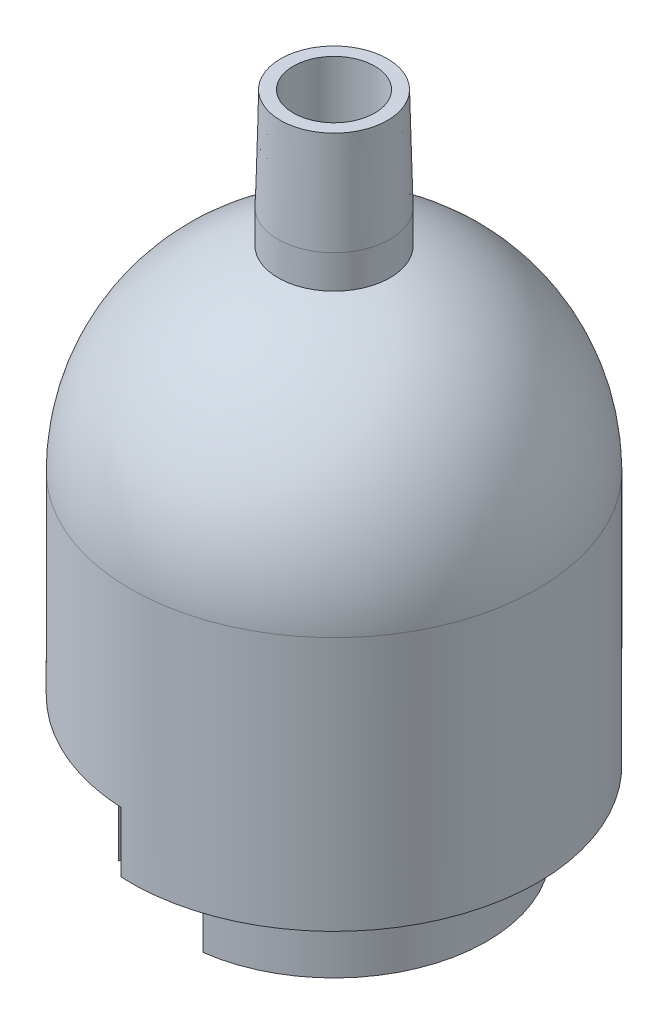
ISO-10303-21;
HEADER;
FILE_DESCRIPTION(('STEP AP214'),'2;1');
FILE_NAME('part.step','',(''),(''),'','','');
FILE_SCHEMA(('AUTOMOTIVE_DESIGN { 1 0 10303 214 1 1 1 1 }'));
ENDSEC;
DATA;
#1=APPLICATION_CONTEXT('core data for automotive mechanical design processes');
#2=APPLICATION_PROTOCOL_DEFINITION('international standard','automotive_design',2000,#1);
#3=PRODUCT_CONTEXT('',#1,'mechanical');
#4=PRODUCT('Part','Part','',(#3));
#5=PRODUCT_RELATED_PRODUCT_CATEGORY('part','',(#4));
#6=PRODUCT_DEFINITION_FORMATION('','',#4);
#7=PRODUCT_DEFINITION_CONTEXT('part definition',#1,'design');
#8=PRODUCT_DEFINITION('design','',#6,#7);
#9=PRODUCT_DEFINITION_SHAPE('','',#8);
#10=(LENGTH_UNIT() NAMED_UNIT(*) SI_UNIT(.MILLI.,.METRE.));
#11=(NAMED_UNIT(*) PLANE_ANGLE_UNIT() SI_UNIT($,.RADIAN.));
#12=(NAMED_UNIT(*) SI_UNIT($,.STERADIAN.) SOLID_ANGLE_UNIT());
#13=UNCERTAINTY_MEASURE_WITH_UNIT(LENGTH_MEASURE(1.E-05),#10,'distance_accuracy_value','');
#14=(GEOMETRIC_REPRESENTATION_CONTEXT(3) GLOBAL_UNCERTAINTY_ASSIGNED_CONTEXT((#13)) GLOBAL_UNIT_ASSIGNED_CONTEXT((#10,
#11,#12)) REPRESENTATION_CONTEXT('',''));
#15=CARTESIAN_POINT('',(0.,0.,0.));
#16=DIRECTION('',(0.,0.,1.));
#17=DIRECTION('',(1.,0.,0.));
#18=AXIS2_PLACEMENT_3D('',#15,#16,#17);
#19=CARTESIAN_POINT('',(0.,0.,0.));
#20=DIRECTION('',(0.,1.,0.));
#21=DIRECTION('',(0.,0.,1.));
#22=AXIS2_PLACEMENT_3D('',#19,#20,#21);
#23=PLANE('',#22);
#24=CARTESIAN_POINT('',(-21.1602690825293,0.,-29.1246117974979));
#25=DIRECTION('',(0.,-1.,0.));
#26=DIRECTION('',(0.,0.,-1.));
#27=AXIS2_PLACEMENT_3D('',#24,#25,#26);
#28=CIRCLE('',#27,1.5);
#29=CARTESIAN_POINT('',(-21.1602690825293,0.,-30.6246117974979));
#30=VERTEX_POINT('',#29);
#31=EDGE_CURVE('E285',#30,#30,#28,.T.);
#32=ORIENTED_EDGE('',*,*,#31,.F.);
#33=EDGE_LOOP('',(#32));
#34=FACE_BOUND('',#33,.T.);
#35=CARTESIAN_POINT('',(-34.2380345866256,0.,-11.1246117974978));
#36=DIRECTION('',(0.,-1.,0.));
#37=DIRECTION('',(0.,0.,-1.));
#38=AXIS2_PLACEMENT_3D('',#35,#36,#37);
#39=CIRCLE('',#38,1.5);
#40=CARTESIAN_POINT('',(-34.2380345866256,0.,-12.6246117974978));
#41=VERTEX_POINT('',#40);
#42=EDGE_CURVE('E268',#41,#41,#39,.T.);
#43=ORIENTED_EDGE('',*,*,#42,.F.);
#44=EDGE_LOOP('',(#43));
#45=FACE_BOUND('',#44,.T.);
#46=CARTESIAN_POINT('',(-34.2380345866254,0.,11.1246117974985));
#47=DIRECTION('',(0.,-1.,0.));
#48=DIRECTION('',(0.,0.,-1.));
#49=AXIS2_PLACEMENT_3D('',#46,#47,#48);
#50=CIRCLE('',#49,1.5);
#51=CARTESIAN_POINT('',(-34.2380345866254,0.,9.62461179749849));
#52=VERTEX_POINT('',#51);
#53=EDGE_CURVE('E239',#52,#52,#50,.T.);
#54=ORIENTED_EDGE('',*,*,#53,.F.);
#55=EDGE_LOOP('',(#54));
#56=FACE_BOUND('',#55,.T.);
#57=DIRECTION('',(-0.819178042205052,0.,0.573539305688021));
#58=VECTOR('',#57,1.);
#59=CARTESIAN_POINT('',(-3.81627640035369,0.,-5.45073336587605));
#60=LINE('',#59,#58);
#61=CARTESIAN_POINT('',(-30.2939246678071,0.,13.0873270082637));
#62=VERTEX_POINT('',#61);
#63=CARTESIAN_POINT('',(-36.126859333869,0.,17.1711978228324));
#64=VERTEX_POINT('',#63);
#65=EDGE_CURVE('E204',#62,#64,#60,.T.);
#66=ORIENTED_EDGE('',*,*,#65,.T.);
#67=CARTESIAN_POINT('',(0.,0.,0.));
#68=DIRECTION('',(0.,1.,0.));
#69=DIRECTION('',(0.,0.,1.));
#70=AXIS2_PLACEMENT_3D('',#67,#68,#69);
#71=CIRCLE('',#70,40.);
#72=CARTESIAN_POINT('',(-19.5058879135128,0.,-34.9216313580204));
#73=VERTEX_POINT('',#72);
#74=EDGE_CURVE('E68',#73,#64,#71,.T.);
#75=ORIENTED_EDGE('',*,*,#74,.F.);
#76=DIRECTION('',(-0.487647197837817,0.,-0.873040783950512));
#77=VECTOR('',#76,1.);
#78=CARTESIAN_POINT('',(-1.40847043936586E-13,0.,0.));
#79=LINE('',#78,#77);
#80=CARTESIAN_POINT('',(-16.0923575286481,0.,-28.8103458703668));
#81=VERTEX_POINT('',#80);
#82=EDGE_CURVE('E231',#81,#73,#79,.T.);
#83=ORIENTED_EDGE('',*,*,#82,.F.);
#84=CARTESIAN_POINT('',(0.,0.,0.));
#85=DIRECTION('',(0.,-1.,0.));
#86=DIRECTION('',(0.,0.,-1.));
#87=AXIS2_PLACEMENT_3D('',#84,#85,#86);
#88=CIRCLE('',#87,33.);
#89=EDGE_CURVE('E228',#62,#81,#88,.T.);
#90=ORIENTED_EDGE('',*,*,#89,.F.);
#91=EDGE_LOOP('',(#66,#75,#83,#90));
#92=FACE_BOUND('',#91,.T.);
#93=ADVANCED_FACE('F57',(#34,#45,#56,#92),#23,.F.);
#94=CARTESIAN_POINT('',(0.,50.,0.));
#95=DIRECTION('',(0.,-1.,0.));
#96=DIRECTION('',(0.,0.,-1.));
#97=AXIS2_PLACEMENT_3D('',#94,#95,#96);
#98=CYLINDRICAL_SURFACE('',#97,40.);
#99=CARTESIAN_POINT('',(0.,50.,0.));
#100=DIRECTION('',(0.,1.,0.));
#101=DIRECTION('',(0.,0.,1.));
#102=AXIS2_PLACEMENT_3D('',#99,#100,#101);
#103=CIRCLE('',#102,40.);
#104=CARTESIAN_POINT('',(0.,50.,40.));
#105=VERTEX_POINT('',#104);
#106=EDGE_CURVE('E12',#105,#105,#103,.T.);
#107=ORIENTED_EDGE('',*,*,#106,.F.);
#108=EDGE_LOOP('',(#107));
#109=FACE_BOUND('',#108,.T.);
#110=DIRECTION('',(0.,-1.,0.));
#111=VECTOR('',#110,1.);
#112=CARTESIAN_POINT('',(-36.126859333869,11.84997677,17.1711978228324));
#113=LINE('',#112,#111);
#114=CARTESIAN_POINT('',(-36.126859333869,11.84997677,17.1711978228324));
#115=VERTEX_POINT('',#114);
#116=EDGE_CURVE('E237',#115,#64,#113,.T.);
#117=ORIENTED_EDGE('',*,*,#116,.F.);
#118=CARTESIAN_POINT('',(0.,11.84997677,0.));
#119=DIRECTION('',(0.,-1.,0.));
#120=DIRECTION('',(0.,0.,-1.));
#121=AXIS2_PLACEMENT_3D('',#118,#119,#120);
#122=CIRCLE('',#121,40.);
#123=CARTESIAN_POINT('',(-1.9505371321681,11.84997677,39.9524142561627));
#124=VERTEX_POINT('',#123);
#125=EDGE_CURVE('E218',#124,#115,#122,.T.);
#126=ORIENTED_EDGE('',*,*,#125,.F.);
#127=DIRECTION('',(0.,-1.,0.));
#128=VECTOR('',#127,1.);
#129=CARTESIAN_POINT('',(-1.9505371321681,11.84997677,39.9524142561627));
#130=LINE('',#129,#128);
#131=CARTESIAN_POINT('',(-1.9505371321681,0.,39.9524142561627));
#132=VERTEX_POINT('',#131);
#133=EDGE_CURVE('E240',#124,#132,#130,.T.);
#134=ORIENTED_EDGE('',*,*,#133,.T.);
#135=CARTESIAN_POINT('',(4.19737007297038,0.,-39.7791664627419));
#136=VERTEX_POINT('',#135);
#137=EDGE_CURVE('E294',#132,#136,#71,.T.);
#138=ORIENTED_EDGE('',*,*,#137,.T.);
#139=DIRECTION('',(0.,-1.,0.));
#140=VECTOR('',#139,1.);
#141=CARTESIAN_POINT('',(4.19737007297038,11.84997677,-39.7791664627419));
#142=LINE('',#141,#140);
#143=CARTESIAN_POINT('',(4.19737007297038,11.84997677,-39.7791664627419));
#144=VERTEX_POINT('',#143);
#145=EDGE_CURVE('E248',#144,#136,#142,.T.);
#146=ORIENTED_EDGE('',*,*,#145,.F.);
#147=CARTESIAN_POINT('',(-19.5058879135128,11.84997677,-34.9216313580204));
#148=VERTEX_POINT('',#147);
#149=EDGE_CURVE('E214',#148,#144,#122,.T.);
#150=ORIENTED_EDGE('',*,*,#149,.F.);
#151=DIRECTION('',(0.,-1.,0.));
#152=VECTOR('',#151,1.);
#153=CARTESIAN_POINT('',(-19.5058879135128,11.84997677,-34.9216313580204));
#154=LINE('',#153,#152);
#155=EDGE_CURVE('E250',#148,#73,#154,.T.);
#156=ORIENTED_EDGE('',*,*,#155,.T.);
#157=ORIENTED_EDGE('',*,*,#74,.T.);
#158=EDGE_LOOP('',(#117,#126,#134,#138,#146,#150,#156,#157));
#159=FACE_BOUND('',#158,.T.);
#160=ADVANCED_FACE('F59',(#109,#159),#98,.T.);
#161=CARTESIAN_POINT('',(21.1602690825291,0.,29.1246117974981));
#162=DIRECTION('',(0.,-1.,0.));
#163=DIRECTION('',(0.,0.,-1.));
#164=AXIS2_PLACEMENT_3D('',#161,#162,#163);
#165=CIRCLE('',#164,1.5);
#166=CARTESIAN_POINT('',(21.1602690825291,0.,27.6246117974981));
#167=VERTEX_POINT('',#166);
#168=EDGE_CURVE('E261',#167,#167,#165,.T.);
#169=ORIENTED_EDGE('',*,*,#168,.F.);
#170=EDGE_LOOP('',(#169));
#171=FACE_BOUND('',#170,.T.);
#172=CARTESIAN_POINT('',(34.2380345866255,0.,-11.1246117974983));
#173=DIRECTION('',(0.,-1.,0.));
#174=DIRECTION('',(0.,0.,-1.));
#175=AXIS2_PLACEMENT_3D('',#172,#173,#174);
#176=CIRCLE('',#175,1.5);
#177=CARTESIAN_POINT('',(34.2380345866255,0.,-12.6246117974983));
#178=VERTEX_POINT('',#177);
#179=EDGE_CURVE('E279',#178,#178,#176,.T.);
#180=ORIENTED_EDGE('',*,*,#179,.F.);
#181=EDGE_LOOP('',(#180));
#182=FACE_BOUND('',#181,.T.);
#183=CARTESIAN_POINT('',(34.2380345866256,0.,11.124611797498));
#184=DIRECTION('',(0.,-1.,0.));
#185=DIRECTION('',(0.,0.,-1.));
#186=AXIS2_PLACEMENT_3D('',#183,#184,#185);
#187=CIRCLE('',#186,1.5);
#188=CARTESIAN_POINT('',(34.2380345866256,0.,9.62461179749802));
#189=VERTEX_POINT('',#188);
#190=EDGE_CURVE('E273',#189,#189,#187,.T.);
#191=ORIENTED_EDGE('',*,*,#190,.F.);
#192=EDGE_LOOP('',(#191));
#193=FACE_BOUND('',#192,.T.);
#194=ORIENTED_EDGE('',*,*,#137,.F.);
#195=DIRECTION('',(-0.0487634283041756,0.,0.998810356404069));
#196=VECTOR('',#195,1.);
#197=CARTESIAN_POINT('',(-1.07793096146607E-12,0.,0.));
#198=LINE('',#197,#196);
#199=CARTESIAN_POINT('',(-1.46290284912635,0.,29.964310692122));
#200=VERTEX_POINT('',#199);
#201=EDGE_CURVE('E208',#200,#132,#198,.T.);
#202=ORIENTED_EDGE('',*,*,#201,.F.);
#203=CARTESIAN_POINT('',(0.,0.,0.));
#204=DIRECTION('',(0.,1.,0.));
#205=DIRECTION('',(0.,0.,1.));
#206=AXIS2_PLACEMENT_3D('',#203,#204,#205);
#207=CIRCLE('',#206,30.);
#208=CARTESIAN_POINT('',(4.00883862894171,0.,29.7309470560072));
#209=VERTEX_POINT('',#208);
#210=EDGE_CURVE('E260',#200,#209,#207,.T.);
#211=ORIENTED_EDGE('',*,*,#210,.T.);
#212=CARTESIAN_POINT('',(0.,0.,0.));
#213=DIRECTION('',(0.,1.,0.));
#214=DIRECTION('',(0.,0.,1.));
#215=AXIS2_PLACEMENT_3D('',#212,#213,#214);
#216=CIRCLE('',#215,30.);
#217=CARTESIAN_POINT('',(3.14802755472722,0.,-29.8343748470565));
#218=VERTEX_POINT('',#217);
#219=EDGE_CURVE('E198',#209,#218,#216,.T.);
#220=ORIENTED_EDGE('',*,*,#219,.T.);
#221=DIRECTION('',(0.104934251824316,0.,-0.994479161568542));
#222=VECTOR('',#221,1.);
#223=CARTESIAN_POINT('',(-2.26511715484874E-12,0.,-2.39007897926772E-13));
#224=LINE('',#223,#222);
#225=EDGE_CURVE('E233',#218,#136,#224,.T.);
#226=ORIENTED_EDGE('',*,*,#225,.T.);
#227=EDGE_LOOP('',(#194,#202,#211,#220,#226));
#228=FACE_BOUND('',#227,.T.);
#229=ADVANCED_FACE('F360',(#171,#182,#193,#228),#23,.F.);
#230=CARTESIAN_POINT('',(0.,50.,0.));
#231=DIRECTION('',(0.,-1.,0.));
#232=DIRECTION('',(0.,0.,-1.));
#233=AXIS2_PLACEMENT_3D('',#230,#231,#232);
#234=CYLINDRICAL_SURFACE('',#233,30.);
#235=DIRECTION('',(0.,-1.,0.));
#236=VECTOR('',#235,1.);
#237=CARTESIAN_POINT('',(4.0088386289417,21.84997677,29.7309470560072));
#238=LINE('',#237,#236);
#239=CARTESIAN_POINT('',(4.00883862894171,21.84997677,29.7309470560072));
#240=VERTEX_POINT('',#239);
#241=EDGE_CURVE('E199',#240,#209,#238,.T.);
#242=ORIENTED_EDGE('',*,*,#241,.T.);
#243=ORIENTED_EDGE('',*,*,#210,.F.);
#244=DIRECTION('',(0.,-1.,0.));
#245=VECTOR('',#244,1.);
#246=CARTESIAN_POINT('',(-1.46290284912635,11.84997677,29.964310692122));
#247=LINE('',#246,#245);
#248=CARTESIAN_POINT('',(-1.46290284912635,11.84997677,29.964310692122));
#249=VERTEX_POINT('',#248);
#250=EDGE_CURVE('E243',#249,#200,#247,.T.);
#251=ORIENTED_EDGE('',*,*,#250,.F.);
#252=CARTESIAN_POINT('',(0.,11.84997677,0.));
#253=DIRECTION('',(0.,-1.,0.));
#254=DIRECTION('',(0.,0.,-1.));
#255=AXIS2_PLACEMENT_3D('',#252,#253,#254);
#256=CIRCLE('',#255,30.);
#257=CARTESIAN_POINT('',(-19.9092408020485,11.84997677,22.441526924121));
#258=VERTEX_POINT('',#257);
#259=EDGE_CURVE('E221',#249,#258,#256,.T.);
#260=ORIENTED_EDGE('',*,*,#259,.T.);
#261=DIRECTION('',(0.,-1.,0.));
#262=VECTOR('',#261,1.);
#263=CARTESIAN_POINT('',(-19.9092408020485,21.84997677,22.441526924121));
#264=LINE('',#263,#262);
#265=CARTESIAN_POINT('',(-19.9092408020485,21.84997677,22.441526924121));
#266=VERTEX_POINT('',#265);
#267=EDGE_CURVE('E81',#266,#258,#264,.T.);
#268=ORIENTED_EDGE('',*,*,#267,.F.);
#269=CARTESIAN_POINT('',(0.,21.84997677,0.));
#270=DIRECTION('',(0.,-1.,0.));
#271=DIRECTION('',(0.,0.,-1.));
#272=AXIS2_PLACEMENT_3D('',#269,#270,#271);
#273=CIRCLE('',#272,30.);
#274=EDGE_CURVE('E76',#266,#240,#273,.T.);
#275=ORIENTED_EDGE('',*,*,#274,.T.);
#276=EDGE_LOOP('',(#242,#243,#251,#260,#268,#275));
#277=FACE_BOUND('',#276,.T.);
#278=CARTESIAN_POINT('',(0.,50.,0.));
#279=DIRECTION('',(0.,1.,0.));
#280=DIRECTION('',(0.,0.,-1.));
#281=AXIS2_PLACEMENT_3D('',#278,#279,#280);
#282=CIRCLE('',#281,30.);
#283=CARTESIAN_POINT('',(0.,50.0000000000002,-30.));
#284=VERTEX_POINT('',#283);
#285=EDGE_CURVE('E181',#284,#284,#282,.T.);
#286=ORIENTED_EDGE('',*,*,#285,.T.);
#287=EDGE_LOOP('',(#286));
#288=FACE_BOUND('',#287,.T.);
#289=ADVANCED_FACE('F369',(#277,#288),#234,.F.);
#290=CARTESIAN_POINT('',(34.2380345866256,6.,11.124611797498));
#291=DIRECTION('',(0.,-1.,0.));
#292=DIRECTION('',(0.,0.,-1.));
#293=AXIS2_PLACEMENT_3D('',#290,#291,#292);
#294=CYLINDRICAL_SURFACE('',#293,1.5);
#295=CARTESIAN_POINT('',(34.2380345866256,6.,11.124611797498));
#296=DIRECTION('',(0.,-1.,0.));
#297=DIRECTION('',(0.,0.,-1.));
#298=AXIS2_PLACEMENT_3D('',#295,#296,#297);
#299=CIRCLE('',#298,1.5);
#300=CARTESIAN_POINT('',(34.2380345866256,6.,9.62461179749802));
#301=VERTEX_POINT('',#300);
#302=EDGE_CURVE('E264',#301,#301,#299,.T.);
#303=ORIENTED_EDGE('',*,*,#302,.F.);
#304=EDGE_LOOP('',(#303));
#305=FACE_BOUND('',#304,.T.);
#306=ORIENTED_EDGE('',*,*,#190,.T.);
#307=EDGE_LOOP('',(#306));
#308=FACE_BOUND('',#307,.T.);
#309=ADVANCED_FACE('F374',(#305,#308),#294,.F.);
#310=CARTESIAN_POINT('',(34.2380345866256,6.,11.124611797498));
#311=DIRECTION('',(0.,-1.,0.));
#312=DIRECTION('',(0.,0.,-1.));
#313=AXIS2_PLACEMENT_3D('',#310,#311,#312);
#314=PLANE('',#313);
#315=ORIENTED_EDGE('',*,*,#302,.T.);
#316=EDGE_LOOP('',(#315));
#317=FACE_BOUND('',#316,.T.);
#318=ADVANCED_FACE('F455',(#317),#314,.T.);
#319=CARTESIAN_POINT('',(34.2380345866255,6.,-11.1246117974983));
#320=DIRECTION('',(0.,-1.,0.));
#321=DIRECTION('',(0.,0.,-1.));
#322=AXIS2_PLACEMENT_3D('',#319,#320,#321);
#323=CYLINDRICAL_SURFACE('',#322,1.5);
#324=CARTESIAN_POINT('',(34.2380345866255,6.,-11.1246117974983));
#325=DIRECTION('',(0.,-1.,0.));
#326=DIRECTION('',(0.,0.,-1.));
#327=AXIS2_PLACEMENT_3D('',#324,#325,#326);
#328=CIRCLE('',#327,1.5);
#329=CARTESIAN_POINT('',(34.2380345866255,6.,-12.6246117974983));
#330=VERTEX_POINT('',#329);
#331=EDGE_CURVE('E276',#330,#330,#328,.T.);
#332=ORIENTED_EDGE('',*,*,#331,.F.);
#333=EDGE_LOOP('',(#332));
#334=FACE_BOUND('',#333,.T.);
#335=ORIENTED_EDGE('',*,*,#179,.T.);
#336=EDGE_LOOP('',(#335));
#337=FACE_BOUND('',#336,.T.);
#338=ADVANCED_FACE('F458',(#334,#337),#323,.F.);
#339=CARTESIAN_POINT('',(34.2380345866255,6.,-11.1246117974983));
#340=DIRECTION('',(0.,-1.,0.));
#341=DIRECTION('',(0.,0.,-1.));
#342=AXIS2_PLACEMENT_3D('',#339,#340,#341);
#343=PLANE('',#342);
#344=ORIENTED_EDGE('',*,*,#331,.T.);
#345=EDGE_LOOP('',(#344));
#346=FACE_BOUND('',#345,.T.);
#347=ADVANCED_FACE('F463',(#346),#343,.T.);
#348=CARTESIAN_POINT('',(-21.1602690825293,6.,-29.1246117974979));
#349=DIRECTION('',(0.,-1.,0.));
#350=DIRECTION('',(0.,0.,-1.));
#351=AXIS2_PLACEMENT_3D('',#348,#349,#350);
#352=CYLINDRICAL_SURFACE('',#351,1.5);
#353=CARTESIAN_POINT('',(-21.1602690825293,6.,-29.1246117974979));
#354=DIRECTION('',(0.,-1.,0.));
#355=DIRECTION('',(0.,0.,-1.));
#356=AXIS2_PLACEMENT_3D('',#353,#354,#355);
#357=CIRCLE('',#356,1.5);
#358=CARTESIAN_POINT('',(-21.1602690825293,6.,-30.6246117974979));
#359=VERTEX_POINT('',#358);
#360=EDGE_CURVE('E282',#359,#359,#357,.T.);
#361=ORIENTED_EDGE('',*,*,#360,.F.);
#362=EDGE_LOOP('',(#361));
#363=FACE_BOUND('',#362,.T.);
#364=ORIENTED_EDGE('',*,*,#31,.T.);
#365=EDGE_LOOP('',(#364));
#366=FACE_BOUND('',#365,.T.);
#367=ADVANCED_FACE('F466',(#363,#366),#352,.F.);
#368=CARTESIAN_POINT('',(-21.1602690825293,6.,-29.1246117974979));
#369=DIRECTION('',(0.,-1.,0.));
#370=DIRECTION('',(0.,0.,-1.));
#371=AXIS2_PLACEMENT_3D('',#368,#369,#370);
#372=PLANE('',#371);
#373=ORIENTED_EDGE('',*,*,#360,.T.);
#374=EDGE_LOOP('',(#373));
#375=FACE_BOUND('',#374,.T.);
#376=ADVANCED_FACE('F471',(#375),#372,.T.);
#377=CARTESIAN_POINT('',(-34.2380345866256,6.,-11.1246117974978));
#378=DIRECTION('',(0.,-1.,0.));
#379=DIRECTION('',(0.,0.,-1.));
#380=AXIS2_PLACEMENT_3D('',#377,#378,#379);
#381=CYLINDRICAL_SURFACE('',#380,1.5);
#382=CARTESIAN_POINT('',(-34.2380345866256,6.,-11.1246117974978));
#383=DIRECTION('',(0.,-1.,0.));
#384=DIRECTION('',(0.,0.,-1.));
#385=AXIS2_PLACEMENT_3D('',#382,#383,#384);
#386=CIRCLE('',#385,1.5);
#387=CARTESIAN_POINT('',(-34.2380345866256,6.,-12.6246117974978));
#388=VERTEX_POINT('',#387);
#389=EDGE_CURVE('E288',#388,#388,#386,.T.);
#390=ORIENTED_EDGE('',*,*,#389,.F.);
#391=EDGE_LOOP('',(#390));
#392=FACE_BOUND('',#391,.T.);
#393=ORIENTED_EDGE('',*,*,#42,.T.);
#394=EDGE_LOOP('',(#393));
#395=FACE_BOUND('',#394,.T.);
#396=ADVANCED_FACE('F474',(#392,#395),#381,.F.);
#397=CARTESIAN_POINT('',(-34.2380345866256,6.,-11.1246117974978));
#398=DIRECTION('',(0.,-1.,0.));
#399=DIRECTION('',(0.,0.,-1.));
#400=AXIS2_PLACEMENT_3D('',#397,#398,#399);
#401=PLANE('',#400);
#402=ORIENTED_EDGE('',*,*,#389,.T.);
#403=EDGE_LOOP('',(#402));
#404=FACE_BOUND('',#403,.T.);
#405=ADVANCED_FACE('F453',(#404),#401,.T.);
#406=CARTESIAN_POINT('',(-34.2380345866254,6.,11.1246117974985));
#407=DIRECTION('',(0.,-1.,0.));
#408=DIRECTION('',(0.,0.,-1.));
#409=AXIS2_PLACEMENT_3D('',#406,#407,#408);
#410=CYLINDRICAL_SURFACE('',#409,1.5);
#411=CARTESIAN_POINT('',(-34.2380345866254,6.,11.1246117974985));
#412=DIRECTION('',(0.,-1.,0.));
#413=DIRECTION('',(0.,0.,-1.));
#414=AXIS2_PLACEMENT_3D('',#411,#412,#413);
#415=CIRCLE('',#414,1.5);
#416=CARTESIAN_POINT('',(-34.2380345866254,6.,9.62461179749849));
#417=VERTEX_POINT('',#416);
#418=EDGE_CURVE('E265',#417,#417,#415,.T.);
#419=ORIENTED_EDGE('',*,*,#418,.F.);
#420=EDGE_LOOP('',(#419));
#421=FACE_BOUND('',#420,.T.);
#422=ORIENTED_EDGE('',*,*,#53,.T.);
#423=EDGE_LOOP('',(#422));
#424=FACE_BOUND('',#423,.T.);
#425=ADVANCED_FACE('F449',(#421,#424),#410,.F.);
#426=CARTESIAN_POINT('',(-34.2380345866254,6.,11.1246117974985));
#427=DIRECTION('',(0.,-1.,0.));
#428=DIRECTION('',(0.,0.,-1.));
#429=AXIS2_PLACEMENT_3D('',#426,#427,#428);
#430=PLANE('',#429);
#431=ORIENTED_EDGE('',*,*,#418,.T.);
#432=EDGE_LOOP('',(#431));
#433=FACE_BOUND('',#432,.T.);
#434=ADVANCED_FACE('F445',(#433),#430,.T.);
#435=CARTESIAN_POINT('',(21.1602690825291,6.,29.1246117974981));
#436=DIRECTION('',(0.,-1.,0.));
#437=DIRECTION('',(0.,0.,-1.));
#438=AXIS2_PLACEMENT_3D('',#435,#436,#437);
#439=CYLINDRICAL_SURFACE('',#438,1.5);
#440=CARTESIAN_POINT('',(21.1602690825291,6.,29.1246117974981));
#441=DIRECTION('',(0.,-1.,0.));
#442=DIRECTION('',(0.,0.,-1.));
#443=AXIS2_PLACEMENT_3D('',#440,#441,#442);
#444=CIRCLE('',#443,1.5);
#445=CARTESIAN_POINT('',(21.1602690825291,6.,27.6246117974981));
#446=VERTEX_POINT('',#445);
#447=EDGE_CURVE('E257',#446,#446,#444,.T.);
#448=ORIENTED_EDGE('',*,*,#447,.F.);
#449=EDGE_LOOP('',(#448));
#450=FACE_BOUND('',#449,.T.);
#451=ORIENTED_EDGE('',*,*,#168,.T.);
#452=EDGE_LOOP('',(#451));
#453=FACE_BOUND('',#452,.T.);
#454=ADVANCED_FACE('F441',(#450,#453),#439,.F.);
#455=CARTESIAN_POINT('',(21.1602690825291,6.,29.1246117974981));
#456=DIRECTION('',(0.,-1.,0.));
#457=DIRECTION('',(0.,0.,-1.));
#458=AXIS2_PLACEMENT_3D('',#455,#456,#457);
#459=PLANE('',#458);
#460=ORIENTED_EDGE('',*,*,#447,.T.);
#461=EDGE_LOOP('',(#460));
#462=FACE_BOUND('',#461,.T.);
#463=ADVANCED_FACE('F438',(#462),#459,.T.);
#464=CARTESIAN_POINT('',(-3.81627640035369,11.84997677,-5.45073336587605));
#465=DIRECTION('',(0.573539305688021,0.,0.819178042205052));
#466=DIRECTION('',(0.819178042205053,0.,-0.573539305688021));
#467=AXIS2_PLACEMENT_3D('',#464,#465,#466);
#468=PLANE('',#467);
#469=ORIENTED_EDGE('',*,*,#65,.F.);
#470=DIRECTION('',(0.,-1.,0.));
#471=VECTOR('',#470,1.);
#472=CARTESIAN_POINT('',(-30.2939246678071,11.84997677,13.0873270082637));
#473=LINE('',#472,#471);
#474=CARTESIAN_POINT('',(-30.2939246678071,11.84997677,13.0873270082637));
#475=VERTEX_POINT('',#474);
#476=EDGE_CURVE('E255',#475,#62,#473,.T.);
#477=ORIENTED_EDGE('',*,*,#476,.F.);
#478=DIRECTION('',(-0.819178042205052,0.,0.573539305688021));
#479=VECTOR('',#478,1.);
#480=CARTESIAN_POINT('',(-3.81627640035369,11.84997677,-5.45073336587605));
#481=LINE('',#480,#479);
#482=EDGE_CURVE('E205',#475,#115,#481,.T.);
#483=ORIENTED_EDGE('',*,*,#482,.T.);
#484=ORIENTED_EDGE('',*,*,#116,.T.);
#485=EDGE_LOOP('',(#469,#477,#483,#484));
#486=FACE_BOUND('',#485,.T.);
#487=ADVANCED_FACE('F421',(#486),#468,.T.);
#488=CARTESIAN_POINT('',(-1.07793096146607E-12,11.84997677,0.));
#489=DIRECTION('',(0.998810356404069,0.,0.0487634283041756));
#490=DIRECTION('',(0.0487634283041756,0.,-0.998810356404069));
#491=AXIS2_PLACEMENT_3D('',#488,#489,#490);
#492=PLANE('',#491);
#493=ORIENTED_EDGE('',*,*,#201,.T.);
#494=ORIENTED_EDGE('',*,*,#133,.F.);
#495=DIRECTION('',(-0.0487634283041756,0.,0.998810356404069));
#496=VECTOR('',#495,1.);
#497=CARTESIAN_POINT('',(-1.07793096146607E-12,11.84997677,0.));
#498=LINE('',#497,#496);
#499=EDGE_CURVE('E223',#249,#124,#498,.T.);
#500=ORIENTED_EDGE('',*,*,#499,.F.);
#501=ORIENTED_EDGE('',*,*,#250,.T.);
#502=EDGE_LOOP('',(#493,#494,#500,#501));
#503=FACE_BOUND('',#502,.T.);
#504=ADVANCED_FACE('F393',(#503),#492,.F.);
#505=CARTESIAN_POINT('',(-2.26511715484874E-12,11.84997677,-2.39007897926772E-13));
#506=DIRECTION('',(-0.994479161568543,0.,-0.104934251824316));
#507=DIRECTION('',(-0.104934251824316,0.,0.994479161568543));
#508=AXIS2_PLACEMENT_3D('',#505,#506,#507);
#509=PLANE('',#508);
#510=ORIENTED_EDGE('',*,*,#225,.F.);
#511=DIRECTION('',(0.,-1.,0.));
#512=VECTOR('',#511,1.);
#513=CARTESIAN_POINT('',(3.14802755472722,11.84997677,-29.8343748470565));
#514=LINE('',#513,#512);
#515=CARTESIAN_POINT('',(3.14802755472722,11.84997677,-29.8343748470565));
#516=VERTEX_POINT('',#515);
#517=EDGE_CURVE('E245',#516,#218,#514,.T.);
#518=ORIENTED_EDGE('',*,*,#517,.F.);
#519=DIRECTION('',(0.104934251824316,0.,-0.994479161568542));
#520=VECTOR('',#519,1.);
#521=CARTESIAN_POINT('',(-2.26511715484874E-12,11.84997677,-2.39007897926772E-13));
#522=LINE('',#521,#520);
#523=EDGE_CURVE('E217',#516,#144,#522,.T.);
#524=ORIENTED_EDGE('',*,*,#523,.T.);
#525=ORIENTED_EDGE('',*,*,#145,.T.);
#526=EDGE_LOOP('',(#510,#518,#524,#525));
#527=FACE_BOUND('',#526,.T.);
#528=ADVANCED_FACE('F411',(#527),#509,.T.);
#529=CARTESIAN_POINT('',(-1.40847043936586E-13,11.84997677,0.));
#530=DIRECTION('',(-0.873040783950512,0.,0.487647197837817));
#531=DIRECTION('',(0.487647197837817,0.,0.873040783950512));
#532=AXIS2_PLACEMENT_3D('',#529,#530,#531);
#533=PLANE('',#532);
#534=ORIENTED_EDGE('',*,*,#82,.T.);
#535=ORIENTED_EDGE('',*,*,#155,.F.);
#536=DIRECTION('',(-0.487647197837817,0.,-0.873040783950512));
#537=VECTOR('',#536,1.);
#538=CARTESIAN_POINT('',(-1.40847043936586E-13,11.84997677,0.));
#539=LINE('',#538,#537);
#540=CARTESIAN_POINT('',(-16.0923575286481,11.84997677,-28.8103458703668));
#541=VERTEX_POINT('',#540);
#542=EDGE_CURVE('E211',#541,#148,#539,.T.);
#543=ORIENTED_EDGE('',*,*,#542,.F.);
#544=DIRECTION('',(0.,-1.,0.));
#545=VECTOR('',#544,1.);
#546=CARTESIAN_POINT('',(-16.0923575286481,11.84997677,-28.8103458703668));
#547=LINE('',#546,#545);
#548=EDGE_CURVE('E253',#541,#81,#547,.T.);
#549=ORIENTED_EDGE('',*,*,#548,.T.);
#550=EDGE_LOOP('',(#534,#535,#543,#549));
#551=FACE_BOUND('',#550,.T.);
#552=ADVANCED_FACE('F425',(#551),#533,.F.);
#553=CARTESIAN_POINT('',(0.,11.84997677,0.));
#554=DIRECTION('',(0.,-1.,0.));
#555=DIRECTION('',(0.,0.,-1.));
#556=AXIS2_PLACEMENT_3D('',#553,#554,#555);
#557=CYLINDRICAL_SURFACE('',#556,33.);
#558=ORIENTED_EDGE('',*,*,#89,.T.);
#559=ORIENTED_EDGE('',*,*,#548,.F.);
#560=CARTESIAN_POINT('',(0.,11.84997677,0.));
#561=DIRECTION('',(0.,-1.,0.));
#562=DIRECTION('',(0.,0.,-1.));
#563=AXIS2_PLACEMENT_3D('',#560,#561,#562);
#564=CIRCLE('',#563,33.);
#565=EDGE_CURVE('E207',#475,#541,#564,.T.);
#566=ORIENTED_EDGE('',*,*,#565,.F.);
#567=ORIENTED_EDGE('',*,*,#476,.T.);
#568=EDGE_LOOP('',(#558,#559,#566,#567));
#569=FACE_BOUND('',#568,.T.);
#570=ADVANCED_FACE('F424',(#569),#557,.F.);
#571=CARTESIAN_POINT('',(0.,11.84997677,0.));
#572=DIRECTION('',(0.,-1.,0.));
#573=DIRECTION('',(0.,0.,-1.));
#574=AXIS2_PLACEMENT_3D('',#571,#572,#573);
#575=PLANE('',#574);
#576=ORIENTED_EDGE('',*,*,#482,.F.);
#577=ORIENTED_EDGE('',*,*,#565,.T.);
#578=ORIENTED_EDGE('',*,*,#542,.T.);
#579=ORIENTED_EDGE('',*,*,#149,.T.);
#580=ORIENTED_EDGE('',*,*,#523,.F.);
#581=EDGE_CURVE('E220',#258,#516,#256,.T.);
#582=ORIENTED_EDGE('',*,*,#581,.F.);
#583=ORIENTED_EDGE('',*,*,#259,.F.);
#584=ORIENTED_EDGE('',*,*,#499,.T.);
#585=ORIENTED_EDGE('',*,*,#125,.T.);
#586=EDGE_LOOP('',(#576,#577,#578,#579,#580,#582,#583,#584,#585));
#587=FACE_BOUND('',#586,.T.);
#588=ADVANCED_FACE('F397',(#587),#575,.T.);
#589=CARTESIAN_POINT('',(0.,21.84997677,0.));
#590=DIRECTION('',(0.,-1.,0.));
#591=DIRECTION('',(0.,0.,-1.));
#592=AXIS2_PLACEMENT_3D('',#589,#590,#591);
#593=CYLINDRICAL_SURFACE('',#592,30.);
#594=ORIENTED_EDGE('',*,*,#219,.F.);
#595=CARTESIAN_POINT('',(4.0088386289417,-15.,29.7309470560072));
#596=VERTEX_POINT('',#595);
#597=EDGE_CURVE('E201',#209,#596,#238,.T.);
#598=ORIENTED_EDGE('',*,*,#597,.T.);
#599=CARTESIAN_POINT('',(0.,-15.,0.));
#600=DIRECTION('',(0.,-1.,0.));
#601=DIRECTION('',(0.,0.,-1.));
#602=AXIS2_PLACEMENT_3D('',#599,#600,#601);
#603=CIRCLE('',#602,30.);
#604=CARTESIAN_POINT('',(-19.9092408020485,-15.,22.441526924121));
#605=VERTEX_POINT('',#604);
#606=EDGE_CURVE('E175',#605,#596,#603,.T.);
#607=ORIENTED_EDGE('',*,*,#606,.F.);
#608=EDGE_CURVE('E165',#258,#605,#264,.T.);
#609=ORIENTED_EDGE('',*,*,#608,.F.);
#610=ORIENTED_EDGE('',*,*,#581,.T.);
#611=ORIENTED_EDGE('',*,*,#517,.T.);
#612=EDGE_LOOP('',(#594,#598,#607,#609,#610,#611));
#613=FACE_BOUND('',#612,.T.);
#614=ADVANCED_FACE('F403',(#613),#593,.T.);
#615=CARTESIAN_POINT('',(0.,21.84997677,0.));
#616=DIRECTION('',(0.,-1.,0.));
#617=DIRECTION('',(0.,0.,-1.));
#618=AXIS2_PLACEMENT_3D('',#615,#616,#617);
#619=CYLINDRICAL_SURFACE('',#618,28.);
#620=DIRECTION('',(0.,-1.,0.));
#621=VECTOR('',#620,1.);
#622=CARTESIAN_POINT('',(-19.230258498937,21.84997677,20.3518342678016));
#623=LINE('',#622,#621);
#624=CARTESIAN_POINT('',(-19.230258498937,21.84997677,20.3518342678016));
#625=VERTEX_POINT('',#624);
#626=CARTESIAN_POINT('',(-19.230258498937,-15.,20.3518342678016));
#627=VERTEX_POINT('',#626);
#628=EDGE_CURVE('E155',#625,#627,#623,.T.);
#629=ORIENTED_EDGE('',*,*,#628,.T.);
#630=CARTESIAN_POINT('',(0.,-15.,0.));
#631=DIRECTION('',(0.,1.,0.));
#632=DIRECTION('',(0.,0.,-1.));
#633=AXIS2_PLACEMENT_3D('',#630,#631,#632);
#634=CIRCLE('',#633,28.);
#635=CARTESIAN_POINT('',(4.70036246264258,-15.,27.602655537462));
#636=VERTEX_POINT('',#635);
#637=EDGE_CURVE('E159',#636,#627,#634,.T.);
#638=ORIENTED_EDGE('',*,*,#637,.F.);
#639=DIRECTION('',(0.,-1.,0.));
#640=VECTOR('',#639,1.);
#641=CARTESIAN_POINT('',(4.70036246264258,21.84997677,27.602655537462));
#642=LINE('',#641,#640);
#643=CARTESIAN_POINT('',(4.70036246264258,21.84997677,27.602655537462));
#644=VERTEX_POINT('',#643);
#645=EDGE_CURVE('E196',#644,#636,#642,.T.);
#646=ORIENTED_EDGE('',*,*,#645,.F.);
#647=CARTESIAN_POINT('',(0.,21.84997677,0.));
#648=DIRECTION('',(0.,1.,0.));
#649=DIRECTION('',(0.,0.,-1.));
#650=AXIS2_PLACEMENT_3D('',#647,#648,#649);
#651=CIRCLE('',#650,28.);
#652=EDGE_CURVE('E161',#644,#625,#651,.T.);
#653=ORIENTED_EDGE('',*,*,#652,.T.);
#654=EDGE_LOOP('',(#629,#638,#646,#653));
#655=FACE_BOUND('',#654,.T.);
#656=ADVANCED_FACE('F157',(#655),#619,.F.);
#657=CARTESIAN_POINT('',(4.00883862894171,21.84997677,29.7309470560072));
#658=DIRECTION('',(-0.951056516295143,0.,-0.309016994374979));
#659=DIRECTION('',(-0.309016994374979,0.,0.951056516295143));
#660=AXIS2_PLACEMENT_3D('',#657,#658,#659);
#661=PLANE('',#660);
#662=ORIENTED_EDGE('',*,*,#645,.T.);
#663=DIRECTION('',(0.309016994374979,0.,-0.951056516295143));
#664=VECTOR('',#663,1.);
#665=CARTESIAN_POINT('',(4.00883862894171,-15.,29.7309470560072));
#666=LINE('',#665,#664);
#667=EDGE_CURVE('E180',#596,#636,#666,.T.);
#668=ORIENTED_EDGE('',*,*,#667,.F.);
#669=ORIENTED_EDGE('',*,*,#597,.F.);
#670=ORIENTED_EDGE('',*,*,#241,.F.);
#671=DIRECTION('',(0.309016994374979,0.,-0.951056516295143));
#672=VECTOR('',#671,1.);
#673=CARTESIAN_POINT('',(4.00883862894171,21.84997677,29.7309470560072));
#674=LINE('',#673,#672);
#675=EDGE_CURVE('E166',#240,#644,#674,.T.);
#676=ORIENTED_EDGE('',*,*,#675,.T.);
#677=EDGE_LOOP('',(#662,#668,#669,#670,#676));
#678=FACE_BOUND('',#677,.T.);
#679=ADVANCED_FACE('F408',(#678),#661,.T.);
#680=CARTESIAN_POINT('',(-19.9092408020485,21.84997677,22.441526924121));
#681=DIRECTION('',(0.951056516295143,0.,0.309016994374979));
#682=DIRECTION('',(0.309016994374979,0.,-0.951056516295143));
#683=AXIS2_PLACEMENT_3D('',#680,#681,#682);
#684=PLANE('',#683);
#685=ORIENTED_EDGE('',*,*,#267,.T.);
#686=ORIENTED_EDGE('',*,*,#608,.T.);
#687=DIRECTION('',(-0.309016994374979,0.,0.951056516295143));
#688=VECTOR('',#687,1.);
#689=CARTESIAN_POINT('',(-19.9092408020485,-15.,22.441526924121));
#690=LINE('',#689,#688);
#691=EDGE_CURVE('E169',#627,#605,#690,.T.);
#692=ORIENTED_EDGE('',*,*,#691,.F.);
#693=ORIENTED_EDGE('',*,*,#628,.F.);
#694=DIRECTION('',(-0.309016994374979,0.,0.951056516295143));
#695=VECTOR('',#694,1.);
#696=CARTESIAN_POINT('',(-19.9092408020485,21.84997677,22.441526924121));
#697=LINE('',#696,#695);
#698=EDGE_CURVE('E191',#625,#266,#697,.T.);
#699=ORIENTED_EDGE('',*,*,#698,.T.);
#700=EDGE_LOOP('',(#685,#686,#692,#693,#699));
#701=FACE_BOUND('',#700,.T.);
#702=ADVANCED_FACE('F170',(#701),#684,.T.);
#703=CARTESIAN_POINT('',(0.,21.84997677,0.));
#704=DIRECTION('',(0.,-1.,0.));
#705=DIRECTION('',(0.,0.,-1.));
#706=AXIS2_PLACEMENT_3D('',#703,#704,#705);
#707=PLANE('',#706);
#708=ORIENTED_EDGE('',*,*,#652,.F.);
#709=ORIENTED_EDGE('',*,*,#675,.F.);
#710=ORIENTED_EDGE('',*,*,#274,.F.);
#711=ORIENTED_EDGE('',*,*,#698,.F.);
#712=EDGE_LOOP('',(#708,#709,#710,#711));
#713=FACE_BOUND('',#712,.T.);
#714=ADVANCED_FACE('F405',(#713),#707,.F.);
#715=CARTESIAN_POINT('',(0.,-15.,0.));
#716=DIRECTION('',(0.,-1.,0.));
#717=DIRECTION('',(0.,0.,-1.));
#718=AXIS2_PLACEMENT_3D('',#715,#716,#717);
#719=PLANE('',#718);
#720=ORIENTED_EDGE('',*,*,#637,.T.);
#721=ORIENTED_EDGE('',*,*,#691,.T.);
#722=ORIENTED_EDGE('',*,*,#606,.T.);
#723=ORIENTED_EDGE('',*,*,#667,.T.);
#724=EDGE_LOOP('',(#720,#721,#722,#723));
#725=FACE_BOUND('',#724,.T.);
#726=ADVANCED_FACE('F178',(#725),#719,.T.);
#727=CARTESIAN_POINT('',(0.,50.,0.));
#728=DIRECTION('',(-1.,0.,0.));
#729=DIRECTION('',(0.,0.,-1.));
#730=AXIS2_PLACEMENT_3D('',#727,#728,#729);
#731=SPHERICAL_SURFACE('',#730,30.);
#732=CARTESIAN_POINT('',(0.,50.,0.));
#733=DIRECTION('',(0.,-1.,0.));
#734=DIRECTION('',(0.,0.,-1.));
#735=AXIS2_PLACEMENT_3D('',#732,#733,#734);
#736=SPHERICAL_SURFACE('',#735,30.);
#737=CARTESIAN_POINT('',(0.,78.9136645896019,0.));
#738=DIRECTION('',(0.,-1.,0.));
#739=DIRECTION('',(0.,0.,-1.));
#740=AXIS2_PLACEMENT_3D('',#737,#738,#739);
#741=CIRCLE('',#740,8.);
#742=CARTESIAN_POINT('',(0.,78.9136645896019,-8.));
#743=VERTEX_POINT('',#742);
#744=EDGE_CURVE('E309',#743,#743,#741,.F.);
#745=ORIENTED_EDGE('',*,*,#744,.T.);
#746=EDGE_LOOP('',(#745));
#747=FACE_BOUND('',#746,.T.);
#748=ORIENTED_EDGE('',*,*,#285,.F.);
#749=EDGE_LOOP('',(#748));
#750=FACE_BOUND('',#749,.T.);
#751=ADVANCED_FACE('F590',(#747,#750),#736,.F.);
#752=CARTESIAN_POINT('',(0.,50.,0.));
#753=DIRECTION('',(-1.,0.,0.));
#754=DIRECTION('',(0.,0.,-1.));
#755=AXIS2_PLACEMENT_3D('',#752,#753,#754);
#756=SPHERICAL_SURFACE('',#755,40.);
#757=CARTESIAN_POINT('',(0.,50.,0.));
#758=DIRECTION('',(0.,-1.,0.));
#759=DIRECTION('',(0.,0.,-1.));
#760=AXIS2_PLACEMENT_3D('',#757,#758,#759);
#761=SPHERICAL_SURFACE('',#760,40.);
#762=CARTESIAN_POINT('',(0.,88.4577690460588,0.));
#763=DIRECTION('',(0.,-1.,0.));
#764=DIRECTION('',(0.,0.,-1.));
#765=AXIS2_PLACEMENT_3D('',#762,#763,#764);
#766=CIRCLE('',#765,11.);
#767=CARTESIAN_POINT('',(0.,88.4577690460588,-11.));
#768=VERTEX_POINT('',#767);
#769=EDGE_CURVE('E184',#768,#768,#766,.T.);
#770=ORIENTED_EDGE('',*,*,#769,.T.);
#771=EDGE_LOOP('',(#770));
#772=FACE_BOUND('',#771,.T.);
#773=ORIENTED_EDGE('',*,*,#106,.T.);
#774=EDGE_LOOP('',(#773));
#775=FACE_BOUND('',#774,.T.);
#776=ADVANCED_FACE('F597',(#772,#775),#761,.T.);
#777=CARTESIAN_POINT('',(0.,88.,0.));
#778=DIRECTION('',(0.,1.,0.));
#779=DIRECTION('',(0.,0.,1.));
#780=AXIS2_PLACEMENT_3D('',#777,#778,#779);
#781=CYLINDRICAL_SURFACE('',#780,11.);
#782=CARTESIAN_POINT('',(0.,95.,0.));
#783=DIRECTION('',(0.,1.,0.));
#784=DIRECTION('',(-1.,0.,-2.89470824284868E-11));
#785=AXIS2_PLACEMENT_3D('',#782,#783,#784);
#786=CIRCLE('',#785,11.);
#787=CARTESIAN_POINT('',(-11.,95.,-3.18417906713355E-10));
#788=VERTEX_POINT('',#787);
#789=EDGE_CURVE('E299',#788,#788,#786,.T.);
#790=ORIENTED_EDGE('',*,*,#789,.F.);
#791=EDGE_LOOP('',(#790));
#792=FACE_BOUND('',#791,.T.);
#793=ORIENTED_EDGE('',*,*,#769,.F.);
#794=EDGE_LOOP('',(#793));
#795=FACE_BOUND('',#794,.T.);
#796=ADVANCED_FACE('F303',(#792,#795),#781,.T.);
#797=CARTESIAN_POINT('',(0.,115.,0.));
#798=DIRECTION('',(0.,-1.,0.));
#799=DIRECTION('',(0.,0.,-1.));
#800=AXIS2_PLACEMENT_3D('',#797,#798,#799);
#801=CONICAL_SURFACE('',#800,10.5,0.0249947936189201);
#802=CARTESIAN_POINT('',(0.,115.,0.));
#803=DIRECTION('',(0.,1.,0.));
#804=DIRECTION('',(0.,0.,1.));
#805=AXIS2_PLACEMENT_3D('',#802,#803,#804);
#806=CIRCLE('',#805,10.5);
#807=CARTESIAN_POINT('',(0.,115.,10.5));
#808=VERTEX_POINT('',#807);
#809=EDGE_CURVE('E307',#808,#808,#806,.F.);
#810=ORIENTED_EDGE('',*,*,#809,.T.);
#811=EDGE_LOOP('',(#810));
#812=FACE_BOUND('',#811,.T.);
#813=ORIENTED_EDGE('',*,*,#789,.T.);
#814=EDGE_LOOP('',(#813));
#815=FACE_BOUND('',#814,.T.);
#816=ADVANCED_FACE('F327',(#812,#815),#801,.T.);
#817=CARTESIAN_POINT('',(0.,115.,0.));
#818=DIRECTION('',(0.,-1.,0.));
#819=DIRECTION('',(0.,0.,-1.));
#820=AXIS2_PLACEMENT_3D('',#817,#818,#819);
#821=PLANE('',#820);
#822=CARTESIAN_POINT('',(0.,115.,0.));
#823=DIRECTION('',(0.,1.,0.));
#824=DIRECTION('',(0.,0.,1.));
#825=AXIS2_PLACEMENT_3D('',#822,#823,#824);
#826=CIRCLE('',#825,8.);
#827=CARTESIAN_POINT('',(0.,115.,8.));
#828=VERTEX_POINT('',#827);
#829=EDGE_CURVE('E315',#828,#828,#826,.T.);
#830=ORIENTED_EDGE('',*,*,#829,.F.);
#831=EDGE_LOOP('',(#830));
#832=FACE_BOUND('',#831,.T.);
#833=ORIENTED_EDGE('',*,*,#809,.F.);
#834=EDGE_LOOP('',(#833));
#835=FACE_BOUND('',#834,.T.);
#836=ADVANCED_FACE('F335',(#832,#835),#821,.F.);
#837=CARTESIAN_POINT('',(0.,75.,0.));
#838=DIRECTION('',(0.,1.,0.));
#839=DIRECTION('',(0.,0.,1.));
#840=AXIS2_PLACEMENT_3D('',#837,#838,#839);
#841=CYLINDRICAL_SURFACE('',#840,8.);
#842=ORIENTED_EDGE('',*,*,#829,.T.);
#843=EDGE_LOOP('',(#842));
#844=FACE_BOUND('',#843,.T.);
#845=ORIENTED_EDGE('',*,*,#744,.F.);
#846=EDGE_LOOP('',(#845));
#847=FACE_BOUND('',#846,.T.);
#848=ADVANCED_FACE('F351',(#844,#847),#841,.F.);
#849=CLOSED_SHELL('',(#93,#160,#229,#289,#309,#318,#338,#347,#367,#376,#396,#405,#425,#434,#454,
#463,#487,#504,#528,#552,#570,#588,#614,#656,#679,#702,#714,#726,#751,#776,#796,#816,#836,#848));
#850=MANIFOLD_SOLID_BREP('B2',#849);
#851=ADVANCED_BREP_SHAPE_REPRESENTATION('',(#18,#850),#14);
#852=SHAPE_DEFINITION_REPRESENTATION(#9,#851);
ENDSEC;
END-ISO-10303-21;
